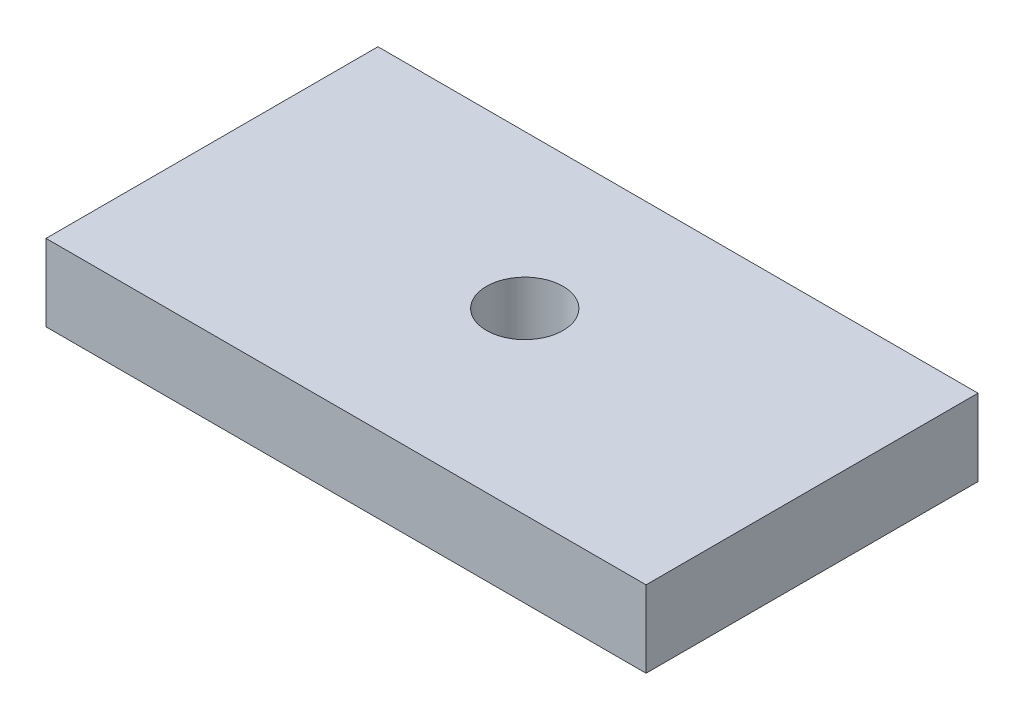
ISO-10303-21;
HEADER;
FILE_DESCRIPTION(('STEP AP214'),'2;1');
FILE_NAME('part.step','',(''),(''),'','','');
FILE_SCHEMA(('AUTOMOTIVE_DESIGN { 1 0 10303 214 1 1 1 1 }'));
ENDSEC;
DATA;
#1=APPLICATION_CONTEXT('core data for automotive mechanical design processes');
#2=APPLICATION_PROTOCOL_DEFINITION('international standard','automotive_design',2000,#1);
#3=PRODUCT_CONTEXT('',#1,'mechanical');
#4=PRODUCT('Part','Part','',(#3));
#5=PRODUCT_RELATED_PRODUCT_CATEGORY('part','',(#4));
#6=PRODUCT_DEFINITION_FORMATION('','',#4);
#7=PRODUCT_DEFINITION_CONTEXT('part definition',#1,'design');
#8=PRODUCT_DEFINITION('design','',#6,#7);
#9=PRODUCT_DEFINITION_SHAPE('','',#8);
#10=(LENGTH_UNIT() NAMED_UNIT(*) SI_UNIT(.MILLI.,.METRE.));
#11=(NAMED_UNIT(*) PLANE_ANGLE_UNIT() SI_UNIT($,.RADIAN.));
#12=(NAMED_UNIT(*) SI_UNIT($,.STERADIAN.) SOLID_ANGLE_UNIT());
#13=UNCERTAINTY_MEASURE_WITH_UNIT(LENGTH_MEASURE(1.E-05),#10,'distance_accuracy_value','');
#14=(GEOMETRIC_REPRESENTATION_CONTEXT(3) GLOBAL_UNCERTAINTY_ASSIGNED_CONTEXT((#13)) GLOBAL_UNIT_ASSIGNED_CONTEXT((#10,
#11,#12)) REPRESENTATION_CONTEXT('',''));
#15=CARTESIAN_POINT('',(0.,0.,0.));
#16=DIRECTION('',(0.,0.,1.));
#17=DIRECTION('',(1.,0.,0.));
#18=AXIS2_PLACEMENT_3D('',#15,#16,#17);
#19=CARTESIAN_POINT('',(10.0420980017642,2.38591703056768,13.));
#20=DIRECTION('',(-1.,0.,0.));
#21=DIRECTION('',(0.,0.,1.));
#22=AXIS2_PLACEMENT_3D('',#19,#20,#21);
#23=PLANE('',#22);
#24=DIRECTION('',(0.,1.,0.));
#25=VECTOR('',#24,1.);
#26=CARTESIAN_POINT('',(10.0420980017642,2.38591703056768,0.));
#27=LINE('',#26,#25);
#28=CARTESIAN_POINT('',(10.0420980017642,2.38591703056768,0.));
#29=VERTEX_POINT('',#28);
#30=CARTESIAN_POINT('',(10.0420980017642,5.38591703056769,0.));
#31=VERTEX_POINT('',#30);
#32=EDGE_CURVE('E88',#29,#31,#27,.T.);
#33=ORIENTED_EDGE('',*,*,#32,.T.);
#34=DIRECTION('',(0.,0.,-1.));
#35=VECTOR('',#34,1.);
#36=CARTESIAN_POINT('',(10.0420980017642,5.38591703056769,13.));
#37=LINE('',#36,#35);
#38=CARTESIAN_POINT('',(10.0420980017642,5.38591703056769,13.));
#39=VERTEX_POINT('',#38);
#40=EDGE_CURVE('E42',#39,#31,#37,.T.);
#41=ORIENTED_EDGE('',*,*,#40,.F.);
#42=DIRECTION('',(0.,1.,0.));
#43=VECTOR('',#42,1.);
#44=CARTESIAN_POINT('',(10.0420980017642,2.38591703056768,13.));
#45=LINE('',#44,#43);
#46=CARTESIAN_POINT('',(10.0420980017642,2.38591703056768,13.));
#47=VERTEX_POINT('',#46);
#48=EDGE_CURVE('E81',#47,#39,#45,.T.);
#49=ORIENTED_EDGE('',*,*,#48,.F.);
#50=DIRECTION('',(0.,0.,-1.));
#51=VECTOR('',#50,1.);
#52=CARTESIAN_POINT('',(10.0420980017642,2.38591703056768,13.));
#53=LINE('',#52,#51);
#54=EDGE_CURVE('E11',#47,#29,#53,.T.);
#55=ORIENTED_EDGE('',*,*,#54,.T.);
#56=EDGE_LOOP('',(#33,#41,#49,#55));
#57=FACE_BOUND('',#56,.T.);
#58=ADVANCED_FACE('F33',(#57),#23,.F.);
#59=CARTESIAN_POINT('',(10.0420980017642,5.38591703056769,13.));
#60=DIRECTION('',(0.,-1.,0.));
#61=DIRECTION('',(1.,0.,0.));
#62=AXIS2_PLACEMENT_3D('',#59,#60,#61);
#63=PLANE('',#62);
#64=CARTESIAN_POINT('',(-1.70790199823578,5.38591703056769,6.));
#65=DIRECTION('',(0.,1.,0.));
#66=DIRECTION('',(-1.,0.,0.));
#67=AXIS2_PLACEMENT_3D('',#64,#65,#66);
#68=CIRCLE('',#67,1.5);
#69=CARTESIAN_POINT('',(-3.20790199823578,5.38591703056769,6.));
#70=VERTEX_POINT('',#69);
#71=EDGE_CURVE('E138',#70,#70,#68,.T.);
#72=ORIENTED_EDGE('',*,*,#71,.F.);
#73=EDGE_LOOP('',(#72));
#74=FACE_BOUND('',#73,.T.);
#75=DIRECTION('',(-1.,0.,0.));
#76=VECTOR('',#75,1.);
#77=CARTESIAN_POINT('',(10.0420980017642,5.38591703056769,0.));
#78=LINE('',#77,#76);
#79=CARTESIAN_POINT('',(-13.4579019982358,5.38591703056768,0.));
#80=VERTEX_POINT('',#79);
#81=EDGE_CURVE('E68',#31,#80,#78,.T.);
#82=ORIENTED_EDGE('',*,*,#81,.T.);
#83=DIRECTION('',(0.,0.,-1.));
#84=VECTOR('',#83,1.);
#85=CARTESIAN_POINT('',(-13.4579019982358,5.38591703056768,13.));
#86=LINE('',#85,#84);
#87=CARTESIAN_POINT('',(-13.4579019982358,5.38591703056768,13.));
#88=VERTEX_POINT('',#87);
#89=EDGE_CURVE('E89',#88,#80,#86,.T.);
#90=ORIENTED_EDGE('',*,*,#89,.F.);
#91=DIRECTION('',(-1.,0.,0.));
#92=VECTOR('',#91,1.);
#93=CARTESIAN_POINT('',(10.0420980017642,5.38591703056769,13.));
#94=LINE('',#93,#92);
#95=EDGE_CURVE('E85',#39,#88,#94,.T.);
#96=ORIENTED_EDGE('',*,*,#95,.F.);
#97=ORIENTED_EDGE('',*,*,#40,.T.);
#98=EDGE_LOOP('',(#82,#90,#96,#97));
#99=FACE_BOUND('',#98,.T.);
#100=ADVANCED_FACE('F91',(#74,#99),#63,.F.);
#101=CARTESIAN_POINT('',(-13.4579019982358,5.38591703056768,13.));
#102=DIRECTION('',(1.,0.,0.));
#103=DIRECTION('',(0.,1.,0.));
#104=AXIS2_PLACEMENT_3D('',#101,#102,#103);
#105=PLANE('',#104);
#106=DIRECTION('',(0.,-1.,0.));
#107=VECTOR('',#106,1.);
#108=CARTESIAN_POINT('',(-13.4579019982358,5.38591703056768,0.));
#109=LINE('',#108,#107);
#110=CARTESIAN_POINT('',(-13.4579019982358,2.38591703056768,0.));
#111=VERTEX_POINT('',#110);
#112=EDGE_CURVE('E101',#80,#111,#109,.T.);
#113=ORIENTED_EDGE('',*,*,#112,.T.);
#114=DIRECTION('',(0.,0.,-1.));
#115=VECTOR('',#114,1.);
#116=CARTESIAN_POINT('',(-13.4579019982358,2.38591703056768,13.));
#117=LINE('',#116,#115);
#118=CARTESIAN_POINT('',(-13.4579019982358,2.38591703056768,13.));
#119=VERTEX_POINT('',#118);
#120=EDGE_CURVE('E95',#119,#111,#117,.T.);
#121=ORIENTED_EDGE('',*,*,#120,.F.);
#122=DIRECTION('',(0.,-1.,0.));
#123=VECTOR('',#122,1.);
#124=CARTESIAN_POINT('',(-13.4579019982358,5.38591703056768,13.));
#125=LINE('',#124,#123);
#126=EDGE_CURVE('E93',#88,#119,#125,.T.);
#127=ORIENTED_EDGE('',*,*,#126,.F.);
#128=ORIENTED_EDGE('',*,*,#89,.T.);
#129=EDGE_LOOP('',(#113,#121,#127,#128));
#130=FACE_BOUND('',#129,.T.);
#131=ADVANCED_FACE('F106',(#130),#105,.F.);
#132=CARTESIAN_POINT('',(-7.45790199823578,2.38591703056768,13.));
#133=DIRECTION('',(0.,1.,0.));
#134=DIRECTION('',(0.,0.,1.));
#135=AXIS2_PLACEMENT_3D('',#132,#133,#134);
#136=PLANE('',#135);
#137=CARTESIAN_POINT('',(-1.70790199823578,2.38591703056768,6.));
#138=DIRECTION('',(0.,1.,0.));
#139=DIRECTION('',(0.,0.,1.));
#140=AXIS2_PLACEMENT_3D('',#137,#138,#139);
#141=CIRCLE('',#140,1.5);
#142=CARTESIAN_POINT('',(-3.20790199823578,2.38591703056768,6.));
#143=VERTEX_POINT('',#142);
#144=EDGE_CURVE('E36',#143,#143,#141,.T.);
#145=ORIENTED_EDGE('',*,*,#144,.T.);
#146=EDGE_LOOP('',(#145));
#147=FACE_BOUND('',#146,.T.);
#148=DIRECTION('',(1.,0.,0.));
#149=VECTOR('',#148,1.);
#150=CARTESIAN_POINT('',(-7.45790199823578,2.38591703056768,0.));
#151=LINE('',#150,#149);
#152=EDGE_CURVE('E75',#111,#29,#151,.T.);
#153=ORIENTED_EDGE('',*,*,#152,.T.);
#154=ORIENTED_EDGE('',*,*,#54,.F.);
#155=DIRECTION('',(1.,0.,0.));
#156=VECTOR('',#155,1.);
#157=CARTESIAN_POINT('',(-7.23051752382383,2.38591703056768,13.));
#158=LINE('',#157,#156);
#159=EDGE_CURVE('E50',#119,#47,#158,.T.);
#160=ORIENTED_EDGE('',*,*,#159,.F.);
#161=ORIENTED_EDGE('',*,*,#120,.T.);
#162=EDGE_LOOP('',(#153,#154,#160,#161));
#163=FACE_BOUND('',#162,.T.);
#164=ADVANCED_FACE('F118',(#147,#163),#136,.F.);
#165=CARTESIAN_POINT('',(0.,0.,13.));
#166=DIRECTION('',(0.,0.,1.));
#167=DIRECTION('',(1.,0.,0.));
#168=AXIS2_PLACEMENT_3D('',#165,#166,#167);
#169=PLANE('',#168);
#170=ORIENTED_EDGE('',*,*,#159,.T.);
#171=ORIENTED_EDGE('',*,*,#48,.T.);
#172=ORIENTED_EDGE('',*,*,#95,.T.);
#173=ORIENTED_EDGE('',*,*,#126,.T.);
#174=EDGE_LOOP('',(#170,#171,#172,#173));
#175=FACE_BOUND('',#174,.T.);
#176=ADVANCED_FACE('F83',(#175),#169,.T.);
#177=CARTESIAN_POINT('',(0.,0.,0.));
#178=DIRECTION('',(0.,0.,1.));
#179=DIRECTION('',(1.,0.,0.));
#180=AXIS2_PLACEMENT_3D('',#177,#178,#179);
#181=PLANE('',#180);
#182=ORIENTED_EDGE('',*,*,#32,.F.);
#183=ORIENTED_EDGE('',*,*,#152,.F.);
#184=ORIENTED_EDGE('',*,*,#112,.F.);
#185=ORIENTED_EDGE('',*,*,#81,.F.);
#186=EDGE_LOOP('',(#182,#183,#184,#185));
#187=FACE_BOUND('',#186,.T.);
#188=ADVANCED_FACE('F108',(#187),#181,.F.);
#189=CARTESIAN_POINT('',(-1.70790199823578,-7.61408296943231,6.));
#190=DIRECTION('',(0.,1.,0.));
#191=DIRECTION('',(-1.,0.,0.));
#192=AXIS2_PLACEMENT_3D('',#189,#190,#191);
#193=CYLINDRICAL_SURFACE('',#192,1.5);
#194=CARTESIAN_POINT('',(-3.20790199823578,5.38591703056769,6.));
#195=CARTESIAN_POINT('',(-3.20790199823578,5.35466703056769,6.));
#196=CARTESIAN_POINT('',(-3.20790199823578,5.32341703056769,6.));
#197=CARTESIAN_POINT('',(-3.20790199823578,5.26091703056769,6.));
#198=CARTESIAN_POINT('',(-3.20790199823578,5.22966703056769,6.));
#199=CARTESIAN_POINT('',(-3.20790199823578,5.16716703056769,6.));
#200=CARTESIAN_POINT('',(-3.20790199823578,5.13591703056769,6.));
#201=CARTESIAN_POINT('',(-3.20790199823578,5.07341703056769,6.));
#202=CARTESIAN_POINT('',(-3.20790199823578,5.04216703056769,6.));
#203=CARTESIAN_POINT('',(-3.20790199823578,4.97966703056769,6.));
#204=CARTESIAN_POINT('',(-3.20790199823578,4.94841703056769,6.));
#205=CARTESIAN_POINT('',(-3.20790199823578,4.88591703056769,6.));
#206=CARTESIAN_POINT('',(-3.20790199823578,4.85466703056769,6.));
#207=CARTESIAN_POINT('',(-3.20790199823578,4.79216703056769,6.));
#208=CARTESIAN_POINT('',(-3.20790199823578,4.76091703056769,6.));
#209=CARTESIAN_POINT('',(-3.20790199823578,4.69841703056769,6.));
#210=CARTESIAN_POINT('',(-3.20790199823578,4.66716703056769,6.));
#211=CARTESIAN_POINT('',(-3.20790199823578,4.60466703056769,6.));
#212=CARTESIAN_POINT('',(-3.20790199823578,4.57341703056769,6.));
#213=CARTESIAN_POINT('',(-3.20790199823578,4.51091703056769,6.));
#214=CARTESIAN_POINT('',(-3.20790199823578,4.47966703056769,6.));
#215=CARTESIAN_POINT('',(-3.20790199823578,4.41716703056769,6.));
#216=CARTESIAN_POINT('',(-3.20790199823578,4.38591703056769,6.));
#217=CARTESIAN_POINT('',(-3.20790199823578,4.32341703056769,6.));
#218=CARTESIAN_POINT('',(-3.20790199823578,4.29216703056769,6.));
#219=CARTESIAN_POINT('',(-3.20790199823578,4.22966703056769,6.));
#220=CARTESIAN_POINT('',(-3.20790199823578,4.19841703056769,6.));
#221=CARTESIAN_POINT('',(-3.20790199823578,4.13591703056769,6.));
#222=CARTESIAN_POINT('',(-3.20790199823578,4.10466703056769,6.));
#223=CARTESIAN_POINT('',(-3.20790199823578,4.04216703056769,6.));
#224=CARTESIAN_POINT('',(-3.20790199823578,4.01091703056769,6.));
#225=CARTESIAN_POINT('',(-3.20790199823578,3.94841703056769,6.));
#226=CARTESIAN_POINT('',(-3.20790199823578,3.91716703056769,6.));
#227=CARTESIAN_POINT('',(-3.20790199823578,3.85466703056769,6.));
#228=CARTESIAN_POINT('',(-3.20790199823578,3.82341703056769,6.));
#229=CARTESIAN_POINT('',(-3.20790199823578,3.76091703056769,6.));
#230=CARTESIAN_POINT('',(-3.20790199823578,3.72966703056769,6.));
#231=CARTESIAN_POINT('',(-3.20790199823578,3.66716703056769,6.));
#232=CARTESIAN_POINT('',(-3.20790199823578,3.63591703056769,6.));
#233=CARTESIAN_POINT('',(-3.20790199823578,3.57341703056769,6.));
#234=CARTESIAN_POINT('',(-3.20790199823578,3.54216703056769,6.));
#235=CARTESIAN_POINT('',(-3.20790199823578,3.47966703056769,6.));
#236=CARTESIAN_POINT('',(-3.20790199823578,3.44841703056769,6.));
#237=CARTESIAN_POINT('',(-3.20790199823578,3.38591703056768,6.));
#238=CARTESIAN_POINT('',(-3.20790199823578,3.35466703056768,6.));
#239=CARTESIAN_POINT('',(-3.20790199823578,3.29216703056768,6.));
#240=CARTESIAN_POINT('',(-3.20790199823578,3.26091703056768,6.));
#241=CARTESIAN_POINT('',(-3.20790199823578,3.19841703056768,6.));
#242=CARTESIAN_POINT('',(-3.20790199823578,3.16716703056768,6.));
#243=CARTESIAN_POINT('',(-3.20790199823578,3.10466703056768,6.));
#244=CARTESIAN_POINT('',(-3.20790199823578,3.07341703056768,6.));
#245=CARTESIAN_POINT('',(-3.20790199823578,3.01091703056768,6.));
#246=CARTESIAN_POINT('',(-3.20790199823578,2.97966703056768,6.));
#247=CARTESIAN_POINT('',(-3.20790199823578,2.91716703056768,6.));
#248=CARTESIAN_POINT('',(-3.20790199823578,2.88591703056768,6.));
#249=CARTESIAN_POINT('',(-3.20790199823578,2.82341703056768,6.));
#250=CARTESIAN_POINT('',(-3.20790199823578,2.79216703056768,6.));
#251=CARTESIAN_POINT('',(-3.20790199823578,2.72966703056768,6.));
#252=CARTESIAN_POINT('',(-3.20790199823578,2.69841703056768,6.));
#253=CARTESIAN_POINT('',(-3.20790199823578,2.63591703056768,6.));
#254=CARTESIAN_POINT('',(-3.20790199823578,2.60466703056768,6.));
#255=CARTESIAN_POINT('',(-3.20790199823578,2.54216703056768,6.));
#256=CARTESIAN_POINT('',(-3.20790199823578,2.51091703056768,6.));
#257=CARTESIAN_POINT('',(-3.20790199823578,2.44841703056768,6.));
#258=CARTESIAN_POINT('',(-3.20790199823578,2.41716703056768,6.));
#259=CARTESIAN_POINT('',(-3.20790199823578,2.38591703056768,6.));
#260=B_SPLINE_CURVE_WITH_KNOTS('',3,(#194,#195,#196,#197,#198,#199,#200,#201,#202,#203,#204,
#205,#206,#207,#208,#209,#210,#211,#212,#213,#214,#215,#216,#217,#218,#219,#220,#221,#222,#223,
#224,#225,#226,#227,#228,#229,#230,#231,#232,#233,#234,#235,#236,#237,#238,#239,#240,#241,#242,
#243,#244,#245,#246,#247,#248,#249,#250,#251,#252,#253,#254,#255,#256,#257,#258,#259),
.UNSPECIFIED.,.F.,.F.,(4,2,2,2,2,2,2,2,2,2,2,2,2,2,2,2,2,2,2,2,2,2,2,2,2,2,2,2,2,2,2,2,4),(0.,
0.0937500000000001,0.1875,0.28125,0.375,0.46875,0.5625,0.656250000000001,0.750000000000001,
0.843750000000001,0.937500000000001,1.03125,1.125,1.21875,1.3125,1.40625,1.5,1.59375,1.6875,
1.78125,1.875,1.96875,2.0625,2.15625,2.25,2.34375,2.4375,2.53125,2.625,2.71875,2.8125,2.90625,
3.),.UNSPECIFIED.);
#261=EDGE_CURVE('BSEAM110',#70,#143,#260,.T.);
#262=ORIENTED_EDGE('',*,*,#71,.T.);
#263=ORIENTED_EDGE('',*,*,#144,.F.);
#264=ORIENTED_EDGE('',*,*,#261,.T.);
#265=ORIENTED_EDGE('',*,*,#261,.F.);
#266=EDGE_LOOP('',(#262,#264,#263,#265));
#267=FACE_BOUND('',#266,.T.);
#268=ADVANCED_FACE('F110',(#267),#193,.F.);
#269=CLOSED_SHELL('',(#58,#100,#131,#164,#176,#188,#268));
#270=MANIFOLD_SOLID_BREP('B2',#269);
#271=ADVANCED_BREP_SHAPE_REPRESENTATION('',(#18,#270),#14);
#272=SHAPE_DEFINITION_REPRESENTATION(#9,#271);
ENDSEC;
END-ISO-10303-21;
